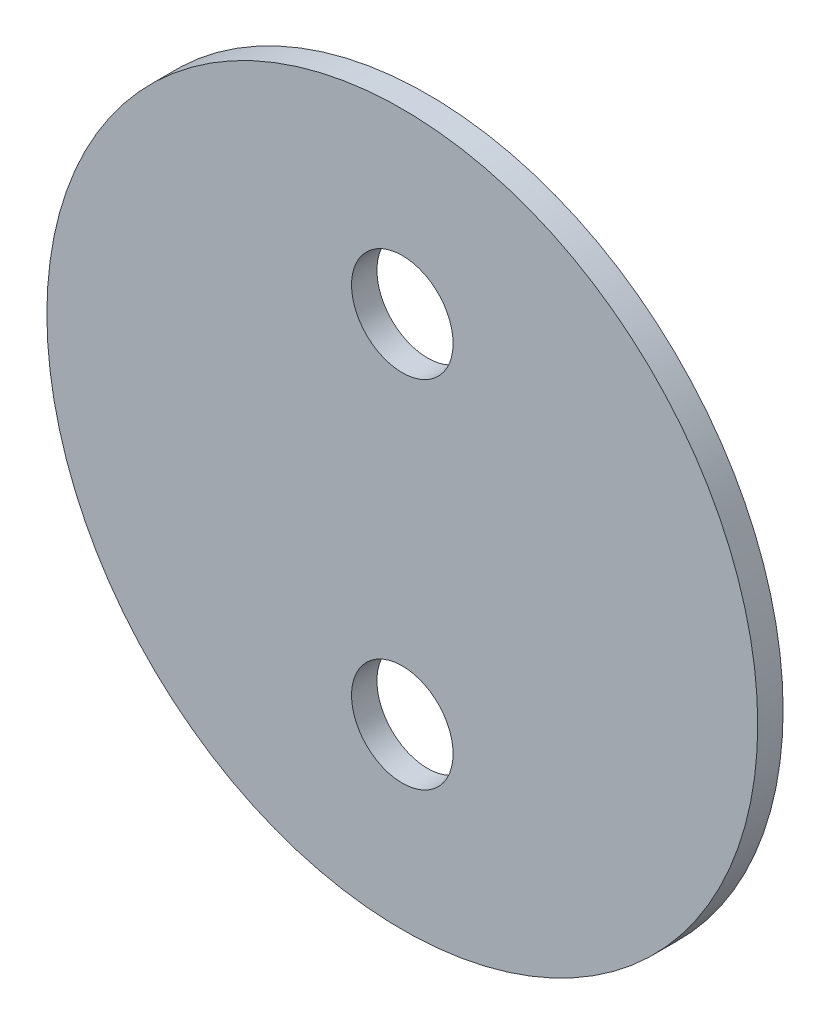
ISO-10303-21;
HEADER;
FILE_DESCRIPTION(('STEP AP214'),'2;1');
FILE_NAME('part.step','',(''),(''),'','','');
FILE_SCHEMA(('AUTOMOTIVE_DESIGN { 1 0 10303 214 1 1 1 1 }'));
ENDSEC;
DATA;
#1=APPLICATION_CONTEXT('core data for automotive mechanical design processes');
#2=APPLICATION_PROTOCOL_DEFINITION('international standard','automotive_design',2000,#1);
#3=PRODUCT_CONTEXT('',#1,'mechanical');
#4=PRODUCT('Part','Part','',(#3));
#5=PRODUCT_RELATED_PRODUCT_CATEGORY('part','',(#4));
#6=PRODUCT_DEFINITION_FORMATION('','',#4);
#7=PRODUCT_DEFINITION_CONTEXT('part definition',#1,'design');
#8=PRODUCT_DEFINITION('design','',#6,#7);
#9=PRODUCT_DEFINITION_SHAPE('','',#8);
#10=(LENGTH_UNIT() NAMED_UNIT(*) SI_UNIT(.MILLI.,.METRE.));
#11=(NAMED_UNIT(*) PLANE_ANGLE_UNIT() SI_UNIT($,.RADIAN.));
#12=(NAMED_UNIT(*) SI_UNIT($,.STERADIAN.) SOLID_ANGLE_UNIT());
#13=UNCERTAINTY_MEASURE_WITH_UNIT(LENGTH_MEASURE(1.E-05),#10,'distance_accuracy_value','');
#14=(GEOMETRIC_REPRESENTATION_CONTEXT(3) GLOBAL_UNCERTAINTY_ASSIGNED_CONTEXT((#13)) GLOBAL_UNIT_ASSIGNED_CONTEXT((#10,
#11,#12)) REPRESENTATION_CONTEXT('',''));
#15=CARTESIAN_POINT('',(0.,0.,0.));
#16=DIRECTION('',(0.,0.,1.));
#17=DIRECTION('',(1.,0.,0.));
#18=AXIS2_PLACEMENT_3D('',#15,#16,#17);
#19=CARTESIAN_POINT('',(0.,0.,0.));
#20=DIRECTION('',(0.,0.,-1.));
#21=DIRECTION('',(-1.,0.,0.));
#22=AXIS2_PLACEMENT_3D('',#19,#20,#21);
#23=CYLINDRICAL_SURFACE('',#22,14.);
#24=CARTESIAN_POINT('',(0.,0.,-1.));
#25=DIRECTION('',(0.,0.,1.));
#26=DIRECTION('',(1.,0.,0.));
#27=AXIS2_PLACEMENT_3D('',#24,#25,#26);
#28=CIRCLE('',#27,14.);
#29=CARTESIAN_POINT('',(14.,0.,-1.));
#30=VERTEX_POINT('',#29);
#31=EDGE_CURVE('E76',#30,#30,#28,.T.);
#32=ORIENTED_EDGE('',*,*,#31,.T.);
#33=EDGE_LOOP('',(#32));
#34=FACE_BOUND('',#33,.T.);
#35=CARTESIAN_POINT('',(0.,0.,0.));
#36=DIRECTION('',(0.,0.,1.));
#37=DIRECTION('',(1.,0.,0.));
#38=AXIS2_PLACEMENT_3D('',#35,#36,#37);
#39=CIRCLE('',#38,14.);
#40=CARTESIAN_POINT('',(14.,0.,0.));
#41=VERTEX_POINT('',#40);
#42=EDGE_CURVE('E36',#41,#41,#39,.T.);
#43=ORIENTED_EDGE('',*,*,#42,.F.);
#44=EDGE_LOOP('',(#43));
#45=FACE_BOUND('',#44,.T.);
#46=ADVANCED_FACE('F33',(#34,#45),#23,.T.);
#47=CARTESIAN_POINT('',(0.,-7.,0.));
#48=DIRECTION('',(0.,0.,-1.));
#49=DIRECTION('',(-1.,0.,0.));
#50=AXIS2_PLACEMENT_3D('',#47,#48,#49);
#51=CYLINDRICAL_SURFACE('',#50,2.);
#52=CARTESIAN_POINT('',(0.,-7.,-1.));
#53=DIRECTION('',(0.,0.,1.));
#54=DIRECTION('',(1.,0.,0.));
#55=AXIS2_PLACEMENT_3D('',#52,#53,#54);
#56=CIRCLE('',#55,2.);
#57=CARTESIAN_POINT('',(2.,-7.,-1.));
#58=VERTEX_POINT('',#57);
#59=EDGE_CURVE('E74',#58,#58,#56,.T.);
#60=ORIENTED_EDGE('',*,*,#59,.F.);
#61=EDGE_LOOP('',(#60));
#62=FACE_BOUND('',#61,.T.);
#63=CARTESIAN_POINT('',(0.,-7.,0.));
#64=DIRECTION('',(0.,0.,1.));
#65=DIRECTION('',(1.,0.,0.));
#66=AXIS2_PLACEMENT_3D('',#63,#64,#65);
#67=CIRCLE('',#66,2.);
#68=CARTESIAN_POINT('',(2.,-7.,0.));
#69=VERTEX_POINT('',#68);
#70=EDGE_CURVE('E51',#69,#69,#67,.T.);
#71=ORIENTED_EDGE('',*,*,#70,.T.);
#72=EDGE_LOOP('',(#71));
#73=FACE_BOUND('',#72,.T.);
#74=ADVANCED_FACE('F89',(#62,#73),#51,.F.);
#75=CARTESIAN_POINT('',(0.,0.,0.));
#76=DIRECTION('',(0.,0.,1.));
#77=DIRECTION('',(1.,0.,0.));
#78=AXIS2_PLACEMENT_3D('',#75,#76,#77);
#79=PLANE('',#78);
#80=CARTESIAN_POINT('',(0.,7.,0.));
#81=DIRECTION('',(0.,0.,1.));
#82=DIRECTION('',(1.,0.,0.));
#83=AXIS2_PLACEMENT_3D('',#80,#81,#82);
#84=CIRCLE('',#83,2.);
#85=CARTESIAN_POINT('',(2.,7.,0.));
#86=VERTEX_POINT('',#85);
#87=EDGE_CURVE('E41',#86,#86,#84,.F.);
#88=ORIENTED_EDGE('',*,*,#87,.T.);
#89=EDGE_LOOP('',(#88));
#90=FACE_BOUND('',#89,.T.);
#91=ORIENTED_EDGE('',*,*,#70,.F.);
#92=EDGE_LOOP('',(#91));
#93=FACE_BOUND('',#92,.T.);
#94=ORIENTED_EDGE('',*,*,#42,.T.);
#95=EDGE_LOOP('',(#94));
#96=FACE_BOUND('',#95,.T.);
#97=ADVANCED_FACE('F70',(#90,#93,#96),#79,.T.);
#98=CARTESIAN_POINT('',(0.,0.,-1.));
#99=DIRECTION('',(0.,0.,1.));
#100=DIRECTION('',(1.,0.,0.));
#101=AXIS2_PLACEMENT_3D('',#98,#99,#100);
#102=PLANE('',#101);
#103=CARTESIAN_POINT('',(0.,7.,-1.));
#104=DIRECTION('',(0.,0.,1.));
#105=DIRECTION('',(1.,0.,0.));
#106=AXIS2_PLACEMENT_3D('',#103,#104,#105);
#107=CIRCLE('',#106,2.);
#108=CARTESIAN_POINT('',(2.,7.,-1.));
#109=VERTEX_POINT('',#108);
#110=EDGE_CURVE('E11',#109,#109,#107,.F.);
#111=ORIENTED_EDGE('',*,*,#110,.F.);
#112=EDGE_LOOP('',(#111));
#113=FACE_BOUND('',#112,.T.);
#114=ORIENTED_EDGE('',*,*,#59,.T.);
#115=EDGE_LOOP('',(#114));
#116=FACE_BOUND('',#115,.T.);
#117=ORIENTED_EDGE('',*,*,#31,.F.);
#118=EDGE_LOOP('',(#117));
#119=FACE_BOUND('',#118,.T.);
#120=ADVANCED_FACE('F67',(#113,#116,#119),#102,.F.);
#121=CARTESIAN_POINT('',(0.,7.,0.));
#122=DIRECTION('',(0.,0.,-1.));
#123=DIRECTION('',(-1.,0.,0.));
#124=AXIS2_PLACEMENT_3D('',#121,#122,#123);
#125=CYLINDRICAL_SURFACE('',#124,2.);
#126=ORIENTED_EDGE('',*,*,#110,.T.);
#127=EDGE_LOOP('',(#126));
#128=FACE_BOUND('',#127,.T.);
#129=ORIENTED_EDGE('',*,*,#87,.F.);
#130=EDGE_LOOP('',(#129));
#131=FACE_BOUND('',#130,.T.);
#132=ADVANCED_FACE('F64',(#128,#131),#125,.F.);
#133=CLOSED_SHELL('',(#46,#74,#97,#120,#132));
#134=MANIFOLD_SOLID_BREP('B2',#133);
#135=ADVANCED_BREP_SHAPE_REPRESENTATION('',(#18,#134),#14);
#136=SHAPE_DEFINITION_REPRESENTATION(#9,#135);
ENDSEC;
END-ISO-10303-21;
